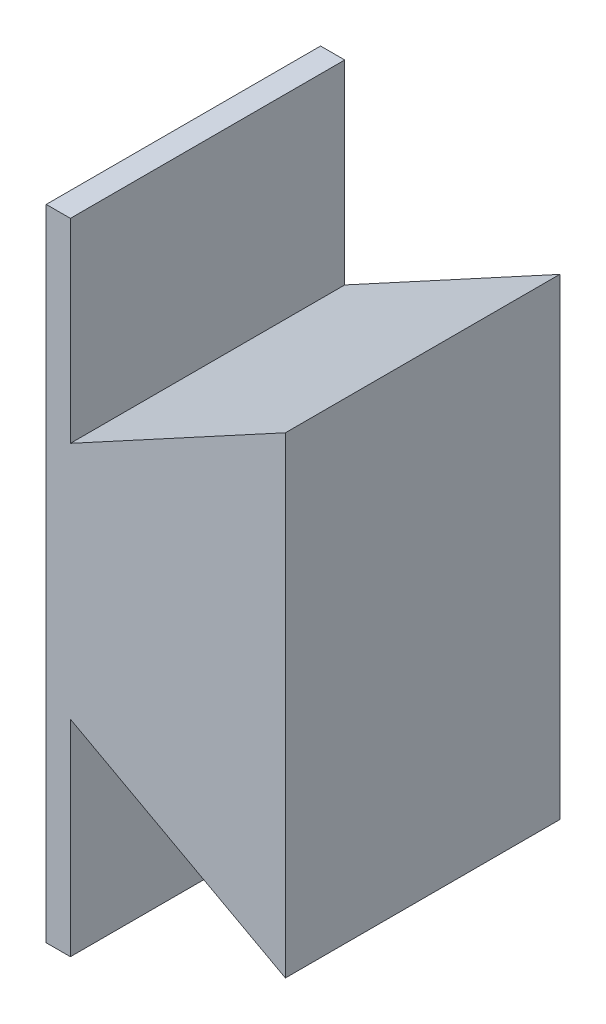
ISO-10303-21;
HEADER;
FILE_DESCRIPTION(('STEP AP214'),'2;1');
FILE_NAME('part.step','',(''),(''),'','','');
FILE_SCHEMA(('AUTOMOTIVE_DESIGN { 1 0 10303 214 1 1 1 1 }'));
ENDSEC;
DATA;
#1=APPLICATION_CONTEXT('core data for automotive mechanical design processes');
#2=APPLICATION_PROTOCOL_DEFINITION('international standard','automotive_design',2000,#1);
#3=PRODUCT_CONTEXT('',#1,'mechanical');
#4=PRODUCT('Part','Part','',(#3));
#5=PRODUCT_RELATED_PRODUCT_CATEGORY('part','',(#4));
#6=PRODUCT_DEFINITION_FORMATION('','',#4);
#7=PRODUCT_DEFINITION_CONTEXT('part definition',#1,'design');
#8=PRODUCT_DEFINITION('design','',#6,#7);
#9=PRODUCT_DEFINITION_SHAPE('','',#8);
#10=(LENGTH_UNIT() NAMED_UNIT(*) SI_UNIT(.MILLI.,.METRE.));
#11=(NAMED_UNIT(*) PLANE_ANGLE_UNIT() SI_UNIT($,.RADIAN.));
#12=(NAMED_UNIT(*) SI_UNIT($,.STERADIAN.) SOLID_ANGLE_UNIT());
#13=UNCERTAINTY_MEASURE_WITH_UNIT(LENGTH_MEASURE(1.E-05),#10,'distance_accuracy_value','');
#14=(GEOMETRIC_REPRESENTATION_CONTEXT(3) GLOBAL_UNCERTAINTY_ASSIGNED_CONTEXT((#13)) GLOBAL_UNIT_ASSIGNED_CONTEXT((#10,
#11,#12)) REPRESENTATION_CONTEXT('',''));
#15=CARTESIAN_POINT('',(0.,0.,0.));
#16=DIRECTION('',(0.,0.,1.));
#17=DIRECTION('',(1.,0.,0.));
#18=AXIS2_PLACEMENT_3D('',#15,#16,#17);
#19=CARTESIAN_POINT('',(130.896291351817,38.0210152059206,-115.01));
#20=DIRECTION('',(1.,0.,0.));
#21=DIRECTION('',(0.,0.,-1.));
#22=AXIS2_PLACEMENT_3D('',#19,#20,#21);
#23=PLANE('',#22);
#24=DIRECTION('',(0.,0.,-1.));
#25=VECTOR('',#24,1.);
#26=CARTESIAN_POINT('',(130.896291351817,48.9858851943017,141.53588771213));
#27=LINE('',#26,#25);
#28=CARTESIAN_POINT('',(130.896291351817,48.9858851943017,-99.5612445611803));
#29=VERTEX_POINT('',#28);
#30=CARTESIAN_POINT('',(130.896291351817,48.9858851943017,-115.));
#31=VERTEX_POINT('',#30);
#32=EDGE_CURVE('E182',#29,#31,#27,.T.);
#33=ORIENTED_EDGE('',*,*,#32,.F.);
#34=DIRECTION('',(0.,1.,0.));
#35=VECTOR('',#34,1.);
#36=CARTESIAN_POINT('',(130.896291351817,0.,-99.5612445611803));
#37=LINE('',#36,#35);
#38=CARTESIAN_POINT('',(130.896291351817,38.0210152059206,-99.5612445611803));
#39=VERTEX_POINT('',#38);
#40=EDGE_CURVE('E189',#39,#29,#37,.T.);
#41=ORIENTED_EDGE('',*,*,#40,.F.);
#42=DIRECTION('',(0.,0.,1.));
#43=VECTOR('',#42,1.);
#44=CARTESIAN_POINT('',(130.896291351817,38.0210152059206,-115.01));
#45=LINE('',#44,#43);
#46=CARTESIAN_POINT('',(130.896291351817,38.0210152059206,-115.));
#47=VERTEX_POINT('',#46);
#48=EDGE_CURVE('E11',#47,#39,#45,.T.);
#49=ORIENTED_EDGE('',*,*,#48,.F.);
#50=DIRECTION('',(0.,-1.,0.));
#51=VECTOR('',#50,1.);
#52=CARTESIAN_POINT('',(130.896291351817,70.,-115.));
#53=LINE('',#52,#51);
#54=EDGE_CURVE('E148',#31,#47,#53,.T.);
#55=ORIENTED_EDGE('',*,*,#54,.F.);
#56=EDGE_LOOP('',(#33,#41,#49,#55));
#57=FACE_BOUND('',#56,.T.);
#58=ADVANCED_FACE('F45',(#57),#23,.T.);
#59=CARTESIAN_POINT('',(142.996381437181,44.5862853397348,-115.01));
#60=DIRECTION('',(-0.476903884965473,0.878955450807854,0.));
#61=DIRECTION('',(-0.878955450807855,-0.476903884965473,0.));
#62=AXIS2_PLACEMENT_3D('',#59,#60,#61);
#63=PLANE('',#62);
#64=DIRECTION('',(0.878955450807855,0.476903884965473,0.));
#65=VECTOR('',#64,1.);
#66=CARTESIAN_POINT('',(39.0827805364028,-11.7951841929755,-115.));
#67=LINE('',#66,#65);
#68=CARTESIAN_POINT('',(142.996381437181,44.5862853397348,-115.));
#69=VERTEX_POINT('',#68);
#70=EDGE_CURVE('E169',#47,#69,#67,.T.);
#71=ORIENTED_EDGE('',*,*,#70,.F.);
#72=ORIENTED_EDGE('',*,*,#48,.T.);
#73=DIRECTION('',(-0.878955450807855,-0.476903884965473,0.));
#74=VECTOR('',#73,1.);
#75=CARTESIAN_POINT('',(13.8331557870303,-25.4951323824186,-99.5612445611803));
#76=LINE('',#75,#74);
#77=CARTESIAN_POINT('',(142.996381437181,44.5862853397348,-99.5612445611803));
#78=VERTEX_POINT('',#77);
#79=EDGE_CURVE('E193',#78,#39,#76,.T.);
#80=ORIENTED_EDGE('',*,*,#79,.F.);
#81=DIRECTION('',(0.,0.,1.));
#82=VECTOR('',#81,1.);
#83=CARTESIAN_POINT('',(142.996381437181,44.5862853397348,-115.01));
#84=LINE('',#83,#82);
#85=EDGE_CURVE('E55',#69,#78,#84,.T.);
#86=ORIENTED_EDGE('',*,*,#85,.F.);
#87=EDGE_LOOP('',(#71,#72,#80,#86));
#88=FACE_BOUND('',#87,.T.);
#89=ADVANCED_FACE('F203',(#88),#63,.T.);
#90=CARTESIAN_POINT('',(142.996381437181,44.5862853397348,-115.01));
#91=DIRECTION('',(1.,0.,0.));
#92=DIRECTION('',(0.,0.,-1.));
#93=AXIS2_PLACEMENT_3D('',#90,#91,#92);
#94=PLANE('',#93);
#95=DIRECTION('',(0.,-1.,0.));
#96=VECTOR('',#95,1.);
#97=CARTESIAN_POINT('',(142.996381437181,70.,-115.));
#98=LINE('',#97,#96);
#99=CARTESIAN_POINT('',(142.996381437181,18.0143801043625,-115.));
#100=VERTEX_POINT('',#99);
#101=EDGE_CURVE('E173',#69,#100,#98,.T.);
#102=ORIENTED_EDGE('',*,*,#101,.F.);
#103=ORIENTED_EDGE('',*,*,#85,.T.);
#104=DIRECTION('',(0.,1.,0.));
#105=VECTOR('',#104,1.);
#106=CARTESIAN_POINT('',(142.996381437181,0.,-99.5612445611803));
#107=LINE('',#106,#105);
#108=CARTESIAN_POINT('',(142.996381437181,18.0143801043625,-99.5612445611803));
#109=VERTEX_POINT('',#108);
#110=EDGE_CURVE('E136',#109,#78,#107,.T.);
#111=ORIENTED_EDGE('',*,*,#110,.F.);
#112=DIRECTION('',(0.,0.,1.));
#113=VECTOR('',#112,1.);
#114=CARTESIAN_POINT('',(142.996381437181,18.0143801043625,-115.01));
#115=LINE('',#114,#113);
#116=EDGE_CURVE('E127',#100,#109,#115,.T.);
#117=ORIENTED_EDGE('',*,*,#116,.F.);
#118=EDGE_LOOP('',(#102,#103,#111,#117));
#119=FACE_BOUND('',#118,.T.);
#120=ADVANCED_FACE('F200',(#119),#94,.T.);
#121=CARTESIAN_POINT('',(142.996381437181,18.0143801043625,-115.01));
#122=DIRECTION('',(-0.47690388496548,-0.878955450807851,0.));
#123=DIRECTION('',(0.878955450807851,-0.47690388496548,0.));
#124=AXIS2_PLACEMENT_3D('',#121,#122,#123);
#125=PLANE('',#124);
#126=DIRECTION('',(-0.878955450807851,0.47690388496548,0.));
#127=VECTOR('',#126,1.);
#128=CARTESIAN_POINT('',(6.63873883922034,91.9993465095802,-115.));
#129=LINE('',#128,#127);
#130=CARTESIAN_POINT('',(130.896291351817,24.5796502381768,-115.));
#131=VERTEX_POINT('',#130);
#132=EDGE_CURVE('E177',#100,#131,#129,.T.);
#133=ORIENTED_EDGE('',*,*,#132,.F.);
#134=ORIENTED_EDGE('',*,*,#116,.T.);
#135=DIRECTION('',(0.878955450807851,-0.47690388496548,0.));
#136=VECTOR('',#135,1.);
#137=CARTESIAN_POINT('',(40.0739317781063,73.8580705297002,-99.5612445611803));
#138=LINE('',#137,#136);
#139=CARTESIAN_POINT('',(130.896291351817,24.5796502381768,-99.5612445611803));
#140=VERTEX_POINT('',#139);
#141=EDGE_CURVE('E130',#140,#109,#138,.T.);
#142=ORIENTED_EDGE('',*,*,#141,.F.);
#143=DIRECTION('',(0.,0.,1.));
#144=VECTOR('',#143,1.);
#145=CARTESIAN_POINT('',(130.896291351817,24.5796502381768,-115.01));
#146=LINE('',#145,#144);
#147=EDGE_CURVE('E115',#131,#140,#146,.T.);
#148=ORIENTED_EDGE('',*,*,#147,.F.);
#149=EDGE_LOOP('',(#133,#134,#142,#148));
#150=FACE_BOUND('',#149,.T.);
#151=ADVANCED_FACE('F131',(#150),#125,.T.);
#152=CARTESIAN_POINT('',(130.896291351817,-0.0543782899306134,-115.01));
#153=DIRECTION('',(1.,0.,0.));
#154=DIRECTION('',(0.,1.,0.));
#155=AXIS2_PLACEMENT_3D('',#152,#153,#154);
#156=PLANE('',#155);
#157=DIRECTION('',(0.,0.,1.));
#158=VECTOR('',#157,1.);
#159=CARTESIAN_POINT('',(130.896291351817,12.9995888278982,141.53588771213));
#160=LINE('',#159,#158);
#161=CARTESIAN_POINT('',(130.896291351817,12.9995888278982,-115.));
#162=VERTEX_POINT('',#161);
#163=CARTESIAN_POINT('',(130.896291351817,12.9995888278982,-99.5612445611803));
#164=VERTEX_POINT('',#163);
#165=EDGE_CURVE('E186',#162,#164,#160,.T.);
#166=ORIENTED_EDGE('',*,*,#165,.F.);
#167=DIRECTION('',(0.,-1.,0.));
#168=VECTOR('',#167,1.);
#169=CARTESIAN_POINT('',(130.896291351818,69.9999999999999,-115.));
#170=LINE('',#169,#168);
#171=EDGE_CURVE('E122',#131,#162,#170,.T.);
#172=ORIENTED_EDGE('',*,*,#171,.F.);
#173=ORIENTED_EDGE('',*,*,#147,.T.);
#174=DIRECTION('',(0.,1.,0.));
#175=VECTOR('',#174,1.);
#176=CARTESIAN_POINT('',(130.896291351817,-1.4748306020168E-13,-99.5612445611803));
#177=LINE('',#176,#175);
#178=EDGE_CURVE('E120',#164,#140,#177,.T.);
#179=ORIENTED_EDGE('',*,*,#178,.F.);
#180=EDGE_LOOP('',(#166,#172,#173,#179));
#181=FACE_BOUND('',#180,.T.);
#182=ADVANCED_FACE('F118',(#181),#156,.T.);
#183=CARTESIAN_POINT('',(0.,0.,-99.5612445611803));
#184=DIRECTION('',(0.,0.,1.));
#185=DIRECTION('',(1.,0.,0.));
#186=AXIS2_PLACEMENT_3D('',#183,#184,#185);
#187=PLANE('',#186);
#188=DIRECTION('',(1.,0.,0.));
#189=VECTOR('',#188,1.);
#190=CARTESIAN_POINT('',(0.,12.9995888278982,-99.5612445611803));
#191=LINE('',#190,#189);
#192=CARTESIAN_POINT('',(129.536639846398,12.9995888278982,-99.5612445611803));
#193=VERTEX_POINT('',#192);
#194=EDGE_CURVE('E140',#193,#164,#191,.T.);
#195=ORIENTED_EDGE('',*,*,#194,.T.);
#196=ORIENTED_EDGE('',*,*,#178,.T.);
#197=ORIENTED_EDGE('',*,*,#141,.T.);
#198=ORIENTED_EDGE('',*,*,#110,.T.);
#199=ORIENTED_EDGE('',*,*,#79,.T.);
#200=ORIENTED_EDGE('',*,*,#40,.T.);
#201=DIRECTION('',(-1.,0.,0.));
#202=VECTOR('',#201,1.);
#203=CARTESIAN_POINT('',(0.,48.9858851943017,-99.5612445611803));
#204=LINE('',#203,#202);
#205=CARTESIAN_POINT('',(129.536639846398,48.9858851943017,-99.5612445611803));
#206=VERTEX_POINT('',#205);
#207=EDGE_CURVE('E149',#29,#206,#204,.T.);
#208=ORIENTED_EDGE('',*,*,#207,.T.);
#209=DIRECTION('',(0.,-1.,0.));
#210=VECTOR('',#209,1.);
#211=CARTESIAN_POINT('',(129.536639846398,0.,-99.5612445611803));
#212=LINE('',#211,#210);
#213=EDGE_CURVE('E147',#206,#193,#212,.T.);
#214=ORIENTED_EDGE('',*,*,#213,.T.);
#215=EDGE_LOOP('',(#195,#196,#197,#198,#199,#200,#208,#214));
#216=FACE_BOUND('',#215,.T.);
#217=ADVANCED_FACE('F138',(#216),#187,.T.);
#218=CARTESIAN_POINT('',(130.896291351817,48.9858851943017,141.53588771213));
#219=DIRECTION('',(0.,1.,0.));
#220=DIRECTION('',(0.,0.,1.));
#221=AXIS2_PLACEMENT_3D('',#218,#219,#220);
#222=PLANE('',#221);
#223=ORIENTED_EDGE('',*,*,#207,.F.);
#224=ORIENTED_EDGE('',*,*,#32,.T.);
#225=DIRECTION('',(1.,0.,0.));
#226=VECTOR('',#225,1.);
#227=CARTESIAN_POINT('',(130.896291351817,48.9858851943017,-115.));
#228=LINE('',#227,#226);
#229=CARTESIAN_POINT('',(129.536639846398,48.9858851943017,-115.));
#230=VERTEX_POINT('',#229);
#231=EDGE_CURVE('E49',#230,#31,#228,.T.);
#232=ORIENTED_EDGE('',*,*,#231,.F.);
#233=DIRECTION('',(0.,0.,-1.));
#234=VECTOR('',#233,1.);
#235=CARTESIAN_POINT('',(129.536639846398,48.9858851943017,141.53588771213));
#236=LINE('',#235,#234);
#237=EDGE_CURVE('E71',#206,#230,#236,.T.);
#238=ORIENTED_EDGE('',*,*,#237,.F.);
#239=EDGE_LOOP('',(#223,#224,#232,#238));
#240=FACE_BOUND('',#239,.T.);
#241=ADVANCED_FACE('F208',(#240),#222,.T.);
#242=CARTESIAN_POINT('',(129.536639846398,12.9995888278982,141.53588771213));
#243=DIRECTION('',(-1.,0.,0.));
#244=DIRECTION('',(0.,0.,1.));
#245=AXIS2_PLACEMENT_3D('',#242,#243,#244);
#246=PLANE('',#245);
#247=ORIENTED_EDGE('',*,*,#237,.T.);
#248=DIRECTION('',(0.,1.,0.));
#249=VECTOR('',#248,1.);
#250=CARTESIAN_POINT('',(129.536639846398,12.9995888278982,-115.));
#251=LINE('',#250,#249);
#252=CARTESIAN_POINT('',(129.536639846398,12.9995888278982,-115.));
#253=VERTEX_POINT('',#252);
#254=EDGE_CURVE('E152',#253,#230,#251,.T.);
#255=ORIENTED_EDGE('',*,*,#254,.F.);
#256=DIRECTION('',(0.,0.,-1.));
#257=VECTOR('',#256,1.);
#258=CARTESIAN_POINT('',(129.536639846398,12.9995888278982,141.53588771213));
#259=LINE('',#258,#257);
#260=EDGE_CURVE('E156',#193,#253,#259,.T.);
#261=ORIENTED_EDGE('',*,*,#260,.F.);
#262=ORIENTED_EDGE('',*,*,#213,.F.);
#263=EDGE_LOOP('',(#247,#255,#261,#262));
#264=FACE_BOUND('',#263,.T.);
#265=ADVANCED_FACE('F211',(#264),#246,.T.);
#266=CARTESIAN_POINT('',(146.231375556178,12.9995888278982,141.53588771213));
#267=DIRECTION('',(0.,-1.,0.));
#268=DIRECTION('',(0.,0.,-1.));
#269=AXIS2_PLACEMENT_3D('',#266,#267,#268);
#270=PLANE('',#269);
#271=DIRECTION('',(-1.,0.,0.));
#272=VECTOR('',#271,1.);
#273=CARTESIAN_POINT('',(146.231375556178,12.9995888278982,-115.));
#274=LINE('',#273,#272);
#275=EDGE_CURVE('E63',#162,#253,#274,.T.);
#276=ORIENTED_EDGE('',*,*,#275,.F.);
#277=ORIENTED_EDGE('',*,*,#165,.T.);
#278=ORIENTED_EDGE('',*,*,#194,.F.);
#279=ORIENTED_EDGE('',*,*,#260,.T.);
#280=EDGE_LOOP('',(#276,#277,#278,#279));
#281=FACE_BOUND('',#280,.T.);
#282=ADVANCED_FACE('F215',(#281),#270,.T.);
#283=CARTESIAN_POINT('',(-5.2976725084512,70.,-115.));
#284=DIRECTION('',(0.,0.,-1.));
#285=DIRECTION('',(-1.,0.,0.));
#286=AXIS2_PLACEMENT_3D('',#283,#284,#285);
#287=PLANE('',#286);
#288=ORIENTED_EDGE('',*,*,#132,.T.);
#289=ORIENTED_EDGE('',*,*,#171,.T.);
#290=ORIENTED_EDGE('',*,*,#275,.T.);
#291=ORIENTED_EDGE('',*,*,#254,.T.);
#292=ORIENTED_EDGE('',*,*,#231,.T.);
#293=ORIENTED_EDGE('',*,*,#54,.T.);
#294=ORIENTED_EDGE('',*,*,#70,.T.);
#295=ORIENTED_EDGE('',*,*,#101,.T.);
#296=EDGE_LOOP('',(#288,#289,#290,#291,#292,#293,#294,#295));
#297=FACE_BOUND('',#296,.T.);
#298=ADVANCED_FACE('F47',(#297),#287,.T.);
#299=CLOSED_SHELL('',(#58,#89,#120,#151,#182,#217,#241,#265,#282,#298));
#300=MANIFOLD_SOLID_BREP('B2',#299);
#301=ADVANCED_BREP_SHAPE_REPRESENTATION('',(#18,#300),#14);
#302=SHAPE_DEFINITION_REPRESENTATION(#9,#301);
ENDSEC;
END-ISO-10303-21;
